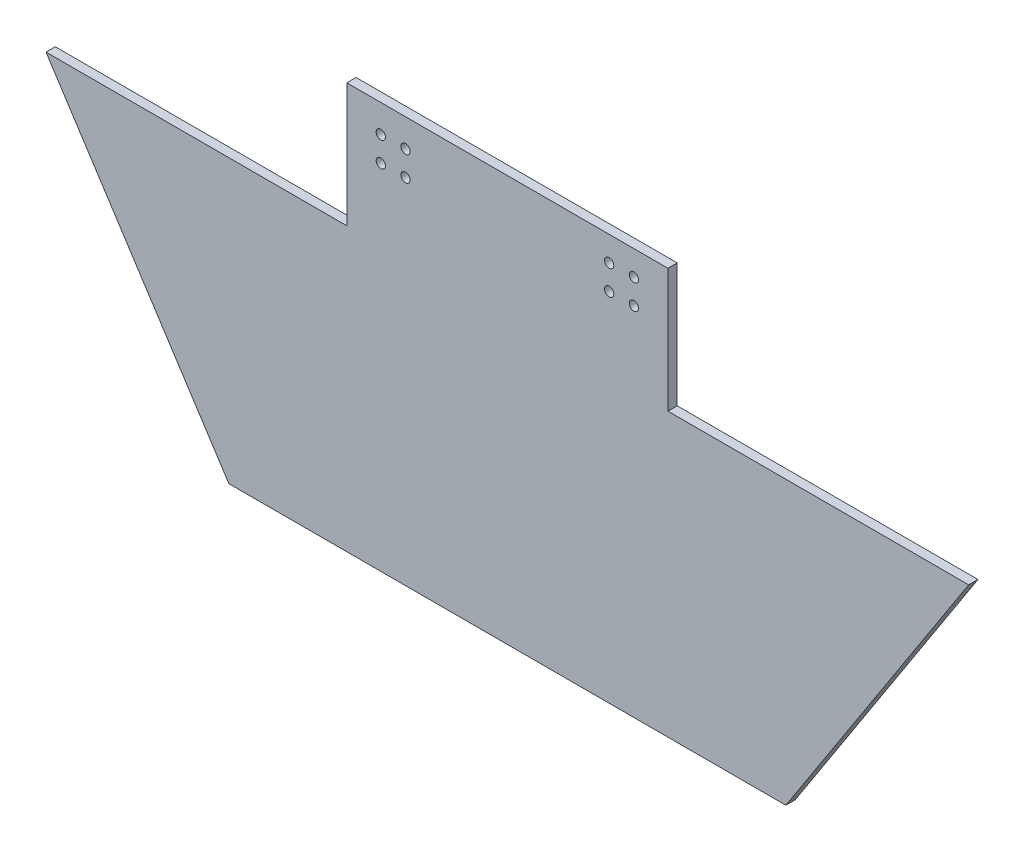
ISO-10303-21;
HEADER;
FILE_DESCRIPTION(('STEP AP214'),'2;1');
FILE_NAME('part.step','',(''),(''),'','','');
FILE_SCHEMA(('AUTOMOTIVE_DESIGN { 1 0 10303 214 1 1 1 1 }'));
ENDSEC;
DATA;
#1=APPLICATION_CONTEXT('core data for automotive mechanical design processes');
#2=APPLICATION_PROTOCOL_DEFINITION('international standard','automotive_design',2000,#1);
#3=PRODUCT_CONTEXT('',#1,'mechanical');
#4=PRODUCT('Part','Part','',(#3));
#5=PRODUCT_RELATED_PRODUCT_CATEGORY('part','',(#4));
#6=PRODUCT_DEFINITION_FORMATION('','',#4);
#7=PRODUCT_DEFINITION_CONTEXT('part definition',#1,'design');
#8=PRODUCT_DEFINITION('design','',#6,#7);
#9=PRODUCT_DEFINITION_SHAPE('','',#8);
#10=(LENGTH_UNIT() NAMED_UNIT(*) SI_UNIT(.MILLI.,.METRE.));
#11=(NAMED_UNIT(*) PLANE_ANGLE_UNIT() SI_UNIT($,.RADIAN.));
#12=(NAMED_UNIT(*) SI_UNIT($,.STERADIAN.) SOLID_ANGLE_UNIT());
#13=UNCERTAINTY_MEASURE_WITH_UNIT(LENGTH_MEASURE(1.E-05),#10,'distance_accuracy_value','');
#14=(GEOMETRIC_REPRESENTATION_CONTEXT(3) GLOBAL_UNCERTAINTY_ASSIGNED_CONTEXT((#13)) GLOBAL_UNIT_ASSIGNED_CONTEXT((#10,
#11,#12)) REPRESENTATION_CONTEXT('',''));
#15=CARTESIAN_POINT('',(0.,0.,0.));
#16=DIRECTION('',(0.,0.,1.));
#17=DIRECTION('',(1.,0.,0.));
#18=AXIS2_PLACEMENT_3D('',#15,#16,#17);
#19=CARTESIAN_POINT('',(85.,-131.238140797559,3.));
#20=DIRECTION('',(0.839333210524171,0.543617293425429,0.));
#21=DIRECTION('',(-0.543617293425429,0.839333210524171,0.));
#22=AXIS2_PLACEMENT_3D('',#19,#20,#21);
#23=PLANE('',#22);
#24=DIRECTION('',(0.543617293425429,-0.83933321052417,0.));
#25=VECTOR('',#24,1.);
#26=CARTESIAN_POINT('',(85.,-131.238140797559,3.));
#27=LINE('',#26,#25);
#28=CARTESIAN_POINT('',(25.9071027624862,-40.,3.));
#29=VERTEX_POINT('',#28);
#30=CARTESIAN_POINT('',(85.,-131.238140797559,3.));
#31=VERTEX_POINT('',#30);
#32=EDGE_CURVE('E140',#29,#31,#27,.T.);
#33=ORIENTED_EDGE('',*,*,#32,.F.);
#34=DIRECTION('',(0.,0.,1.));
#35=VECTOR('',#34,1.);
#36=CARTESIAN_POINT('',(25.9071027624862,-40.,-7.));
#37=LINE('',#36,#35);
#38=CARTESIAN_POINT('',(25.9071027624862,-40.,0.));
#39=VERTEX_POINT('',#38);
#40=EDGE_CURVE('E180',#39,#29,#37,.T.);
#41=ORIENTED_EDGE('',*,*,#40,.F.);
#42=DIRECTION('',(0.543617293425429,-0.83933321052417,0.));
#43=VECTOR('',#42,1.);
#44=CARTESIAN_POINT('',(85.,-131.238140797559,0.));
#45=LINE('',#44,#43);
#46=CARTESIAN_POINT('',(85.,-131.238140797559,0.));
#47=VERTEX_POINT('',#46);
#48=EDGE_CURVE('E131',#39,#47,#45,.T.);
#49=ORIENTED_EDGE('',*,*,#48,.T.);
#50=DIRECTION('',(0.,0.,-1.));
#51=VECTOR('',#50,1.);
#52=CARTESIAN_POINT('',(85.,-131.238140797559,3.));
#53=LINE('',#52,#51);
#54=EDGE_CURVE('E125',#31,#47,#53,.T.);
#55=ORIENTED_EDGE('',*,*,#54,.F.);
#56=EDGE_LOOP('',(#33,#41,#49,#55));
#57=FACE_BOUND('',#56,.T.);
#58=ADVANCED_FACE('F35',(#57),#23,.F.);
#59=CARTESIAN_POINT('',(265.,-131.238140797559,3.));
#60=DIRECTION('',(0.,1.,0.));
#61=DIRECTION('',(-1.,0.,0.));
#62=AXIS2_PLACEMENT_3D('',#59,#60,#61);
#63=PLANE('',#62);
#64=DIRECTION('',(1.,0.,0.));
#65=VECTOR('',#64,1.);
#66=CARTESIAN_POINT('',(265.,-131.238140797559,0.));
#67=LINE('',#66,#65);
#68=CARTESIAN_POINT('',(265.,-131.238140797559,0.));
#69=VERTEX_POINT('',#68);
#70=EDGE_CURVE('E133',#47,#69,#67,.T.);
#71=ORIENTED_EDGE('',*,*,#70,.T.);
#72=DIRECTION('',(0.,0.,-1.));
#73=VECTOR('',#72,1.);
#74=CARTESIAN_POINT('',(265.,-131.238140797559,3.));
#75=LINE('',#74,#73);
#76=CARTESIAN_POINT('',(265.,-131.238140797559,3.));
#77=VERTEX_POINT('',#76);
#78=EDGE_CURVE('E121',#77,#69,#75,.T.);
#79=ORIENTED_EDGE('',*,*,#78,.F.);
#80=DIRECTION('',(1.,0.,0.));
#81=VECTOR('',#80,1.);
#82=CARTESIAN_POINT('',(265.,-131.238140797559,3.));
#83=LINE('',#82,#81);
#84=EDGE_CURVE('E127',#31,#77,#83,.T.);
#85=ORIENTED_EDGE('',*,*,#84,.F.);
#86=ORIENTED_EDGE('',*,*,#54,.T.);
#87=EDGE_LOOP('',(#71,#79,#85,#86));
#88=FACE_BOUND('',#87,.T.);
#89=ADVANCED_FACE('F193',(#88),#63,.F.);
#90=CARTESIAN_POINT('',(330.569672928135,-30.,3.));
#91=DIRECTION('',(-0.839333210524171,0.543617293425428,0.));
#92=DIRECTION('',(-0.543617293425428,-0.839333210524171,0.));
#93=AXIS2_PLACEMENT_3D('',#90,#91,#92);
#94=PLANE('',#93);
#95=DIRECTION('',(0.543617293425428,0.839333210524171,0.));
#96=VECTOR('',#95,1.);
#97=CARTESIAN_POINT('',(330.569672928135,-30.,0.));
#98=LINE('',#97,#96);
#99=CARTESIAN_POINT('',(324.092897237514,-40.,0.));
#100=VERTEX_POINT('',#99);
#101=EDGE_CURVE('E136',#69,#100,#98,.T.);
#102=ORIENTED_EDGE('',*,*,#101,.T.);
#103=DIRECTION('',(0.,0.,1.));
#104=VECTOR('',#103,1.);
#105=CARTESIAN_POINT('',(324.092897237514,-40.,-7.));
#106=LINE('',#105,#104);
#107=CARTESIAN_POINT('',(324.092897237514,-40.,3.));
#108=VERTEX_POINT('',#107);
#109=EDGE_CURVE('E134',#100,#108,#106,.T.);
#110=ORIENTED_EDGE('',*,*,#109,.T.);
#111=DIRECTION('',(0.543617293425428,0.839333210524171,0.));
#112=VECTOR('',#111,1.);
#113=CARTESIAN_POINT('',(330.569672928135,-30.,3.));
#114=LINE('',#113,#112);
#115=EDGE_CURVE('E122',#77,#108,#114,.T.);
#116=ORIENTED_EDGE('',*,*,#115,.F.);
#117=ORIENTED_EDGE('',*,*,#78,.T.);
#118=EDGE_LOOP('',(#102,#110,#116,#117));
#119=FACE_BOUND('',#118,.T.);
#120=ADVANCED_FACE('F198',(#119),#94,.F.);
#121=CARTESIAN_POINT('',(100.,0.,3.));
#122=DIRECTION('',(0.,-1.,0.));
#123=DIRECTION('',(0.,0.,-1.));
#124=AXIS2_PLACEMENT_3D('',#121,#122,#123);
#125=PLANE('',#124);
#126=DIRECTION('',(-1.,0.,0.));
#127=VECTOR('',#126,1.);
#128=CARTESIAN_POINT('',(100.,0.,3.));
#129=LINE('',#128,#127);
#130=CARTESIAN_POINT('',(226.9,0.,3.));
#131=VERTEX_POINT('',#130);
#132=CARTESIAN_POINT('',(123.1,0.,3.));
#133=VERTEX_POINT('',#132);
#134=EDGE_CURVE('E115',#131,#133,#129,.T.);
#135=ORIENTED_EDGE('',*,*,#134,.F.);
#136=DIRECTION('',(0.,0.,1.));
#137=VECTOR('',#136,1.);
#138=CARTESIAN_POINT('',(226.9,0.,-7.));
#139=LINE('',#138,#137);
#140=CARTESIAN_POINT('',(226.9,0.,0.));
#141=VERTEX_POINT('',#140);
#142=EDGE_CURVE('E99',#141,#131,#139,.T.);
#143=ORIENTED_EDGE('',*,*,#142,.F.);
#144=DIRECTION('',(-1.,0.,0.));
#145=VECTOR('',#144,1.);
#146=CARTESIAN_POINT('',(100.,0.,0.));
#147=LINE('',#146,#145);
#148=CARTESIAN_POINT('',(123.1,0.,0.));
#149=VERTEX_POINT('',#148);
#150=EDGE_CURVE('E139',#141,#149,#147,.T.);
#151=ORIENTED_EDGE('',*,*,#150,.T.);
#152=DIRECTION('',(0.,0.,1.));
#153=VECTOR('',#152,1.);
#154=CARTESIAN_POINT('',(123.1,0.,-7.));
#155=LINE('',#154,#153);
#156=EDGE_CURVE('E117',#149,#133,#155,.T.);
#157=ORIENTED_EDGE('',*,*,#156,.T.);
#158=EDGE_LOOP('',(#135,#143,#151,#157));
#159=FACE_BOUND('',#158,.T.);
#160=ADVANCED_FACE('F120',(#159),#125,.F.);
#161=CARTESIAN_POINT('',(0.,0.,3.));
#162=DIRECTION('',(0.,0.,1.));
#163=DIRECTION('',(1.,0.,0.));
#164=AXIS2_PLACEMENT_3D('',#161,#162,#163);
#165=PLANE('',#164);
#166=CARTESIAN_POINT('',(207.9,-8.00000000000001,3.));
#167=DIRECTION('',(0.,0.,1.));
#168=DIRECTION('',(1.,0.,0.));
#169=AXIS2_PLACEMENT_3D('',#166,#167,#168);
#170=CIRCLE('',#169,1.5);
#171=CARTESIAN_POINT('',(209.4,-8.00000000000001,3.));
#172=VERTEX_POINT('',#171);
#173=EDGE_CURVE('E212',#172,#172,#170,.T.);
#174=ORIENTED_EDGE('',*,*,#173,.F.);
#175=EDGE_LOOP('',(#174));
#176=FACE_BOUND('',#175,.T.);
#177=CARTESIAN_POINT('',(142.1,-17.,3.));
#178=DIRECTION('',(0.,0.,1.));
#179=DIRECTION('',(1.,0.,0.));
#180=AXIS2_PLACEMENT_3D('',#177,#178,#179);
#181=CIRCLE('',#180,1.5);
#182=CARTESIAN_POINT('',(143.6,-17.,3.));
#183=VERTEX_POINT('',#182);
#184=EDGE_CURVE('E209',#183,#183,#181,.T.);
#185=ORIENTED_EDGE('',*,*,#184,.F.);
#186=EDGE_LOOP('',(#185));
#187=FACE_BOUND('',#186,.T.);
#188=CARTESIAN_POINT('',(142.1,-9.,3.));
#189=DIRECTION('',(0.,0.,1.));
#190=DIRECTION('',(1.,0.,0.));
#191=AXIS2_PLACEMENT_3D('',#188,#189,#190);
#192=CIRCLE('',#191,1.5);
#193=CARTESIAN_POINT('',(143.6,-9.,3.));
#194=VERTEX_POINT('',#193);
#195=EDGE_CURVE('E206',#194,#194,#192,.T.);
#196=ORIENTED_EDGE('',*,*,#195,.F.);
#197=EDGE_LOOP('',(#196));
#198=FACE_BOUND('',#197,.T.);
#199=CARTESIAN_POINT('',(134.1,-17.,3.));
#200=DIRECTION('',(0.,0.,1.));
#201=DIRECTION('',(1.,0.,0.));
#202=AXIS2_PLACEMENT_3D('',#199,#200,#201);
#203=CIRCLE('',#202,1.5);
#204=CARTESIAN_POINT('',(135.6,-17.,3.));
#205=VERTEX_POINT('',#204);
#206=EDGE_CURVE('E205',#205,#205,#203,.T.);
#207=ORIENTED_EDGE('',*,*,#206,.F.);
#208=EDGE_LOOP('',(#207));
#209=FACE_BOUND('',#208,.T.);
#210=CARTESIAN_POINT('',(215.9,-16.,3.));
#211=DIRECTION('',(0.,0.,1.));
#212=DIRECTION('',(1.,0.,0.));
#213=AXIS2_PLACEMENT_3D('',#210,#211,#212);
#214=CIRCLE('',#213,1.5);
#215=CARTESIAN_POINT('',(217.4,-16.,3.));
#216=VERTEX_POINT('',#215);
#217=EDGE_CURVE('E221',#216,#216,#214,.T.);
#218=ORIENTED_EDGE('',*,*,#217,.F.);
#219=EDGE_LOOP('',(#218));
#220=FACE_BOUND('',#219,.T.);
#221=CARTESIAN_POINT('',(207.9,-16.,3.));
#222=DIRECTION('',(0.,0.,1.));
#223=DIRECTION('',(1.,0.,0.));
#224=AXIS2_PLACEMENT_3D('',#221,#222,#223);
#225=CIRCLE('',#224,1.5);
#226=CARTESIAN_POINT('',(209.4,-16.,3.));
#227=VERTEX_POINT('',#226);
#228=EDGE_CURVE('E218',#227,#227,#225,.T.);
#229=ORIENTED_EDGE('',*,*,#228,.F.);
#230=EDGE_LOOP('',(#229));
#231=FACE_BOUND('',#230,.T.);
#232=CARTESIAN_POINT('',(215.9,-8.,3.));
#233=DIRECTION('',(0.,0.,1.));
#234=DIRECTION('',(1.,0.,0.));
#235=AXIS2_PLACEMENT_3D('',#232,#233,#234);
#236=CIRCLE('',#235,1.5);
#237=CARTESIAN_POINT('',(217.4,-8.,3.));
#238=VERTEX_POINT('',#237);
#239=EDGE_CURVE('E215',#238,#238,#236,.T.);
#240=ORIENTED_EDGE('',*,*,#239,.F.);
#241=EDGE_LOOP('',(#240));
#242=FACE_BOUND('',#241,.T.);
#243=CARTESIAN_POINT('',(134.1,-9.,3.));
#244=DIRECTION('',(0.,0.,1.));
#245=DIRECTION('',(1.,0.,0.));
#246=AXIS2_PLACEMENT_3D('',#243,#244,#245);
#247=CIRCLE('',#246,1.5);
#248=CARTESIAN_POINT('',(135.6,-9.,3.));
#249=VERTEX_POINT('',#248);
#250=EDGE_CURVE('E155',#249,#249,#247,.T.);
#251=ORIENTED_EDGE('',*,*,#250,.F.);
#252=EDGE_LOOP('',(#251));
#253=FACE_BOUND('',#252,.T.);
#254=DIRECTION('',(1.,0.,0.));
#255=VECTOR('',#254,1.);
#256=CARTESIAN_POINT('',(250.,-40.,3.));
#257=LINE('',#256,#255);
#258=CARTESIAN_POINT('',(226.9,-40.,3.));
#259=VERTEX_POINT('',#258);
#260=EDGE_CURVE('E109',#259,#108,#257,.T.);
#261=ORIENTED_EDGE('',*,*,#260,.F.);
#262=DIRECTION('',(0.,-1.,0.));
#263=VECTOR('',#262,1.);
#264=CARTESIAN_POINT('',(226.9,0.,3.));
#265=LINE('',#264,#263);
#266=EDGE_CURVE('E102',#131,#259,#265,.T.);
#267=ORIENTED_EDGE('',*,*,#266,.F.);
#268=ORIENTED_EDGE('',*,*,#134,.T.);
#269=DIRECTION('',(0.,1.,0.));
#270=VECTOR('',#269,1.);
#271=CARTESIAN_POINT('',(123.1,0.,3.));
#272=LINE('',#271,#270);
#273=CARTESIAN_POINT('',(123.1,-40.,3.));
#274=VERTEX_POINT('',#273);
#275=EDGE_CURVE('E177',#274,#133,#272,.T.);
#276=ORIENTED_EDGE('',*,*,#275,.F.);
#277=DIRECTION('',(1.,0.,0.));
#278=VECTOR('',#277,1.);
#279=CARTESIAN_POINT('',(123.1,-40.,3.));
#280=LINE('',#279,#278);
#281=EDGE_CURVE('E174',#29,#274,#280,.T.);
#282=ORIENTED_EDGE('',*,*,#281,.F.);
#283=ORIENTED_EDGE('',*,*,#32,.T.);
#284=ORIENTED_EDGE('',*,*,#84,.T.);
#285=ORIENTED_EDGE('',*,*,#115,.T.);
#286=EDGE_LOOP('',(#261,#267,#268,#276,#282,#283,#284,#285));
#287=FACE_BOUND('',#286,.T.);
#288=ADVANCED_FACE('F113',(#176,#187,#198,#209,#220,#231,#242,#253,#287),#165,.T.);
#289=CARTESIAN_POINT('',(0.,0.,0.));
#290=DIRECTION('',(0.,0.,1.));
#291=DIRECTION('',(1.,0.,0.));
#292=AXIS2_PLACEMENT_3D('',#289,#290,#291);
#293=PLANE('',#292);
#294=CARTESIAN_POINT('',(207.9,-8.00000000000001,0.));
#295=DIRECTION('',(0.,0.,1.));
#296=DIRECTION('',(1.,0.,0.));
#297=AXIS2_PLACEMENT_3D('',#294,#295,#296);
#298=CIRCLE('',#297,1.5);
#299=CARTESIAN_POINT('',(209.4,-8.00000000000001,0.));
#300=VERTEX_POINT('',#299);
#301=EDGE_CURVE('E38',#300,#300,#298,.T.);
#302=ORIENTED_EDGE('',*,*,#301,.T.);
#303=EDGE_LOOP('',(#302));
#304=FACE_BOUND('',#303,.T.);
#305=CARTESIAN_POINT('',(142.1,-17.,0.));
#306=DIRECTION('',(0.,0.,1.));
#307=DIRECTION('',(1.,0.,0.));
#308=AXIS2_PLACEMENT_3D('',#305,#306,#307);
#309=CIRCLE('',#308,1.5);
#310=CARTESIAN_POINT('',(143.6,-17.,0.));
#311=VERTEX_POINT('',#310);
#312=EDGE_CURVE('E169',#311,#311,#309,.T.);
#313=ORIENTED_EDGE('',*,*,#312,.T.);
#314=EDGE_LOOP('',(#313));
#315=FACE_BOUND('',#314,.T.);
#316=CARTESIAN_POINT('',(142.1,-9.,0.));
#317=DIRECTION('',(0.,0.,1.));
#318=DIRECTION('',(1.,0.,0.));
#319=AXIS2_PLACEMENT_3D('',#316,#317,#318);
#320=CIRCLE('',#319,1.5);
#321=CARTESIAN_POINT('',(143.6,-9.,0.));
#322=VERTEX_POINT('',#321);
#323=EDGE_CURVE('E167',#322,#322,#320,.T.);
#324=ORIENTED_EDGE('',*,*,#323,.T.);
#325=EDGE_LOOP('',(#324));
#326=FACE_BOUND('',#325,.T.);
#327=CARTESIAN_POINT('',(134.1,-17.,0.));
#328=DIRECTION('',(0.,0.,1.));
#329=DIRECTION('',(1.,0.,0.));
#330=AXIS2_PLACEMENT_3D('',#327,#328,#329);
#331=CIRCLE('',#330,1.5);
#332=CARTESIAN_POINT('',(135.6,-17.,0.));
#333=VERTEX_POINT('',#332);
#334=EDGE_CURVE('E164',#333,#333,#331,.T.);
#335=ORIENTED_EDGE('',*,*,#334,.T.);
#336=EDGE_LOOP('',(#335));
#337=FACE_BOUND('',#336,.T.);
#338=CARTESIAN_POINT('',(215.9,-16.,0.));
#339=DIRECTION('',(0.,0.,1.));
#340=DIRECTION('',(1.,0.,0.));
#341=AXIS2_PLACEMENT_3D('',#338,#339,#340);
#342=CIRCLE('',#341,1.5);
#343=CARTESIAN_POINT('',(217.4,-16.,0.));
#344=VERTEX_POINT('',#343);
#345=EDGE_CURVE('E161',#344,#344,#342,.T.);
#346=ORIENTED_EDGE('',*,*,#345,.T.);
#347=EDGE_LOOP('',(#346));
#348=FACE_BOUND('',#347,.T.);
#349=CARTESIAN_POINT('',(207.9,-16.,0.));
#350=DIRECTION('',(0.,0.,1.));
#351=DIRECTION('',(1.,0.,0.));
#352=AXIS2_PLACEMENT_3D('',#349,#350,#351);
#353=CIRCLE('',#352,1.5);
#354=CARTESIAN_POINT('',(209.4,-16.,0.));
#355=VERTEX_POINT('',#354);
#356=EDGE_CURVE('E158',#355,#355,#353,.T.);
#357=ORIENTED_EDGE('',*,*,#356,.T.);
#358=EDGE_LOOP('',(#357));
#359=FACE_BOUND('',#358,.T.);
#360=CARTESIAN_POINT('',(215.9,-8.,0.));
#361=DIRECTION('',(0.,0.,1.));
#362=DIRECTION('',(1.,0.,0.));
#363=AXIS2_PLACEMENT_3D('',#360,#361,#362);
#364=CIRCLE('',#363,1.5);
#365=CARTESIAN_POINT('',(217.4,-8.,0.));
#366=VERTEX_POINT('',#365);
#367=EDGE_CURVE('E154',#366,#366,#364,.T.);
#368=ORIENTED_EDGE('',*,*,#367,.T.);
#369=EDGE_LOOP('',(#368));
#370=FACE_BOUND('',#369,.T.);
#371=CARTESIAN_POINT('',(134.1,-9.,0.));
#372=DIRECTION('',(0.,0.,1.));
#373=DIRECTION('',(1.,0.,0.));
#374=AXIS2_PLACEMENT_3D('',#371,#372,#373);
#375=CIRCLE('',#374,1.5);
#376=CARTESIAN_POINT('',(135.6,-9.,0.));
#377=VERTEX_POINT('',#376);
#378=EDGE_CURVE('E151',#377,#377,#375,.T.);
#379=ORIENTED_EDGE('',*,*,#378,.T.);
#380=EDGE_LOOP('',(#379));
#381=FACE_BOUND('',#380,.T.);
#382=DIRECTION('',(0.,-1.,0.));
#383=VECTOR('',#382,1.);
#384=CARTESIAN_POINT('',(226.9,0.,0.));
#385=LINE('',#384,#383);
#386=CARTESIAN_POINT('',(226.9,-40.,0.));
#387=VERTEX_POINT('',#386);
#388=EDGE_CURVE('E43',#141,#387,#385,.T.);
#389=ORIENTED_EDGE('',*,*,#388,.T.);
#390=DIRECTION('',(1.,0.,0.));
#391=VECTOR('',#390,1.);
#392=CARTESIAN_POINT('',(0.,-40.,0.));
#393=LINE('',#392,#391);
#394=EDGE_CURVE('E11',#387,#100,#393,.T.);
#395=ORIENTED_EDGE('',*,*,#394,.T.);
#396=ORIENTED_EDGE('',*,*,#101,.F.);
#397=ORIENTED_EDGE('',*,*,#70,.F.);
#398=ORIENTED_EDGE('',*,*,#48,.F.);
#399=DIRECTION('',(1.,0.,0.));
#400=VECTOR('',#399,1.);
#401=CARTESIAN_POINT('',(0.,-40.,0.));
#402=LINE('',#401,#400);
#403=CARTESIAN_POINT('',(123.1,-40.,0.));
#404=VERTEX_POINT('',#403);
#405=EDGE_CURVE('E144',#39,#404,#402,.T.);
#406=ORIENTED_EDGE('',*,*,#405,.T.);
#407=DIRECTION('',(0.,1.,0.));
#408=VECTOR('',#407,1.);
#409=CARTESIAN_POINT('',(123.1,0.,0.));
#410=LINE('',#409,#408);
#411=EDGE_CURVE('E147',#404,#149,#410,.T.);
#412=ORIENTED_EDGE('',*,*,#411,.T.);
#413=ORIENTED_EDGE('',*,*,#150,.F.);
#414=EDGE_LOOP('',(#389,#395,#396,#397,#398,#406,#412,#413));
#415=FACE_BOUND('',#414,.T.);
#416=ADVANCED_FACE('F232',(#304,#315,#326,#337,#348,#359,#370,#381,#415),#293,.F.);
#417=CARTESIAN_POINT('',(123.1,0.,-7.));
#418=DIRECTION('',(1.,0.,0.));
#419=DIRECTION('',(0.,0.,-1.));
#420=AXIS2_PLACEMENT_3D('',#417,#418,#419);
#421=PLANE('',#420);
#422=DIRECTION('',(0.,0.,1.));
#423=VECTOR('',#422,1.);
#424=CARTESIAN_POINT('',(123.1,-40.,-7.));
#425=LINE('',#424,#423);
#426=EDGE_CURVE('E59',#404,#274,#425,.T.);
#427=ORIENTED_EDGE('',*,*,#426,.T.);
#428=ORIENTED_EDGE('',*,*,#275,.T.);
#429=ORIENTED_EDGE('',*,*,#156,.F.);
#430=ORIENTED_EDGE('',*,*,#411,.F.);
#431=EDGE_LOOP('',(#427,#428,#429,#430));
#432=FACE_BOUND('',#431,.T.);
#433=ADVANCED_FACE('F250',(#432),#421,.F.);
#434=CARTESIAN_POINT('',(123.1,-40.,-7.));
#435=DIRECTION('',(0.,-1.,0.));
#436=DIRECTION('',(0.,0.,-1.));
#437=AXIS2_PLACEMENT_3D('',#434,#435,#436);
#438=PLANE('',#437);
#439=ORIENTED_EDGE('',*,*,#40,.T.);
#440=ORIENTED_EDGE('',*,*,#281,.T.);
#441=ORIENTED_EDGE('',*,*,#426,.F.);
#442=ORIENTED_EDGE('',*,*,#405,.F.);
#443=EDGE_LOOP('',(#439,#440,#441,#442));
#444=FACE_BOUND('',#443,.T.);
#445=ADVANCED_FACE('F256',(#444),#438,.F.);
#446=CARTESIAN_POINT('',(250.,-40.,-7.));
#447=DIRECTION('',(0.,-1.,0.));
#448=DIRECTION('',(0.,0.,-1.));
#449=AXIS2_PLACEMENT_3D('',#446,#447,#448);
#450=PLANE('',#449);
#451=DIRECTION('',(0.,0.,1.));
#452=VECTOR('',#451,1.);
#453=CARTESIAN_POINT('',(226.9,-40.,-7.));
#454=LINE('',#453,#452);
#455=EDGE_CURVE('E51',#387,#259,#454,.T.);
#456=ORIENTED_EDGE('',*,*,#455,.T.);
#457=ORIENTED_EDGE('',*,*,#260,.T.);
#458=ORIENTED_EDGE('',*,*,#109,.F.);
#459=ORIENTED_EDGE('',*,*,#394,.F.);
#460=EDGE_LOOP('',(#456,#457,#458,#459));
#461=FACE_BOUND('',#460,.T.);
#462=ADVANCED_FACE('F258',(#461),#450,.F.);
#463=CARTESIAN_POINT('',(226.9,0.,-7.));
#464=DIRECTION('',(-1.,0.,0.));
#465=DIRECTION('',(0.,0.,1.));
#466=AXIS2_PLACEMENT_3D('',#463,#464,#465);
#467=PLANE('',#466);
#468=ORIENTED_EDGE('',*,*,#142,.T.);
#469=ORIENTED_EDGE('',*,*,#266,.T.);
#470=ORIENTED_EDGE('',*,*,#455,.F.);
#471=ORIENTED_EDGE('',*,*,#388,.F.);
#472=EDGE_LOOP('',(#468,#469,#470,#471));
#473=FACE_BOUND('',#472,.T.);
#474=ADVANCED_FACE('F101',(#473),#467,.F.);
#475=CARTESIAN_POINT('',(134.1,-9.,-7.));
#476=DIRECTION('',(0.,0.,1.));
#477=DIRECTION('',(1.,0.,0.));
#478=AXIS2_PLACEMENT_3D('',#475,#476,#477);
#479=CYLINDRICAL_SURFACE('',#478,1.5);
#480=ORIENTED_EDGE('',*,*,#250,.T.);
#481=EDGE_LOOP('',(#480));
#482=FACE_BOUND('',#481,.T.);
#483=ORIENTED_EDGE('',*,*,#378,.F.);
#484=EDGE_LOOP('',(#483));
#485=FACE_BOUND('',#484,.T.);
#486=ADVANCED_FACE('F241',(#482,#485),#479,.F.);
#487=CARTESIAN_POINT('',(215.9,-8.,-7.));
#488=DIRECTION('',(0.,0.,1.));
#489=DIRECTION('',(1.,0.,0.));
#490=AXIS2_PLACEMENT_3D('',#487,#488,#489);
#491=CYLINDRICAL_SURFACE('',#490,1.5);
#492=ORIENTED_EDGE('',*,*,#239,.T.);
#493=EDGE_LOOP('',(#492));
#494=FACE_BOUND('',#493,.T.);
#495=ORIENTED_EDGE('',*,*,#367,.F.);
#496=EDGE_LOOP('',(#495));
#497=FACE_BOUND('',#496,.T.);
#498=ADVANCED_FACE('F244',(#494,#497),#491,.F.);
#499=CARTESIAN_POINT('',(207.9,-16.,-7.));
#500=DIRECTION('',(0.,0.,1.));
#501=DIRECTION('',(1.,0.,0.));
#502=AXIS2_PLACEMENT_3D('',#499,#500,#501);
#503=CYLINDRICAL_SURFACE('',#502,1.5);
#504=ORIENTED_EDGE('',*,*,#228,.T.);
#505=EDGE_LOOP('',(#504));
#506=FACE_BOUND('',#505,.T.);
#507=ORIENTED_EDGE('',*,*,#356,.F.);
#508=EDGE_LOOP('',(#507));
#509=FACE_BOUND('',#508,.T.);
#510=ADVANCED_FACE('F327',(#506,#509),#503,.F.);
#511=CARTESIAN_POINT('',(215.9,-16.,-7.));
#512=DIRECTION('',(0.,0.,1.));
#513=DIRECTION('',(1.,0.,0.));
#514=AXIS2_PLACEMENT_3D('',#511,#512,#513);
#515=CYLINDRICAL_SURFACE('',#514,1.5);
#516=ORIENTED_EDGE('',*,*,#217,.T.);
#517=EDGE_LOOP('',(#516));
#518=FACE_BOUND('',#517,.T.);
#519=ORIENTED_EDGE('',*,*,#345,.F.);
#520=EDGE_LOOP('',(#519));
#521=FACE_BOUND('',#520,.T.);
#522=ADVANCED_FACE('F227',(#518,#521),#515,.F.);
#523=CARTESIAN_POINT('',(134.1,-17.,-7.));
#524=DIRECTION('',(0.,0.,1.));
#525=DIRECTION('',(1.,0.,0.));
#526=AXIS2_PLACEMENT_3D('',#523,#524,#525);
#527=CYLINDRICAL_SURFACE('',#526,1.5);
#528=ORIENTED_EDGE('',*,*,#206,.T.);
#529=EDGE_LOOP('',(#528));
#530=FACE_BOUND('',#529,.T.);
#531=ORIENTED_EDGE('',*,*,#334,.F.);
#532=EDGE_LOOP('',(#531));
#533=FACE_BOUND('',#532,.T.);
#534=ADVANCED_FACE('F346',(#530,#533),#527,.F.);
#535=CARTESIAN_POINT('',(142.1,-9.,-7.));
#536=DIRECTION('',(0.,0.,1.));
#537=DIRECTION('',(1.,0.,0.));
#538=AXIS2_PLACEMENT_3D('',#535,#536,#537);
#539=CYLINDRICAL_SURFACE('',#538,1.5);
#540=ORIENTED_EDGE('',*,*,#195,.T.);
#541=EDGE_LOOP('',(#540));
#542=FACE_BOUND('',#541,.T.);
#543=ORIENTED_EDGE('',*,*,#323,.F.);
#544=EDGE_LOOP('',(#543));
#545=FACE_BOUND('',#544,.T.);
#546=ADVANCED_FACE('F355',(#542,#545),#539,.F.);
#547=CARTESIAN_POINT('',(142.1,-17.,-7.));
#548=DIRECTION('',(0.,0.,1.));
#549=DIRECTION('',(1.,0.,0.));
#550=AXIS2_PLACEMENT_3D('',#547,#548,#549);
#551=CYLINDRICAL_SURFACE('',#550,1.5);
#552=ORIENTED_EDGE('',*,*,#184,.T.);
#553=EDGE_LOOP('',(#552));
#554=FACE_BOUND('',#553,.T.);
#555=ORIENTED_EDGE('',*,*,#312,.F.);
#556=EDGE_LOOP('',(#555));
#557=FACE_BOUND('',#556,.T.);
#558=ADVANCED_FACE('F365',(#554,#557),#551,.F.);
#559=CARTESIAN_POINT('',(207.9,-8.00000000000001,-7.));
#560=DIRECTION('',(0.,0.,1.));
#561=DIRECTION('',(1.,0.,0.));
#562=AXIS2_PLACEMENT_3D('',#559,#560,#561);
#563=CYLINDRICAL_SURFACE('',#562,1.5);
#564=ORIENTED_EDGE('',*,*,#173,.T.);
#565=EDGE_LOOP('',(#564));
#566=FACE_BOUND('',#565,.T.);
#567=ORIENTED_EDGE('',*,*,#301,.F.);
#568=EDGE_LOOP('',(#567));
#569=FACE_BOUND('',#568,.T.);
#570=ADVANCED_FACE('F375',(#566,#569),#563,.F.);
#571=CLOSED_SHELL('',(#58,#89,#120,#160,#288,#416,#433,#445,#462,#474,#486,#498,#510,#522,#534,
#546,#558,#570));
#572=MANIFOLD_SOLID_BREP('B2',#571);
#573=ADVANCED_BREP_SHAPE_REPRESENTATION('',(#18,#572),#14);
#574=SHAPE_DEFINITION_REPRESENTATION(#9,#573);
ENDSEC;
END-ISO-10303-21;
